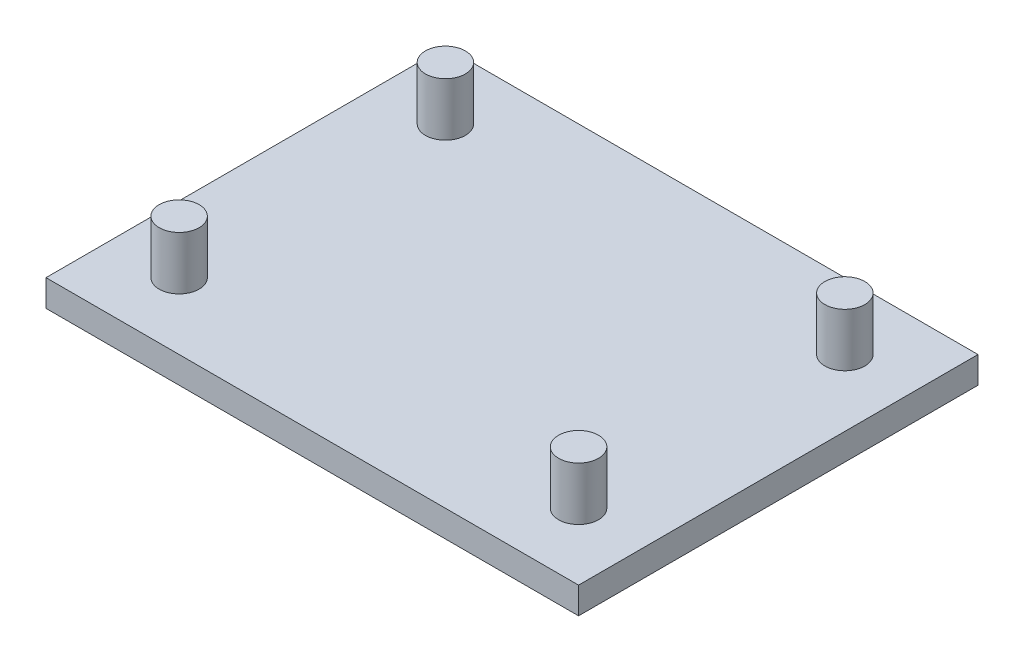
ISO-10303-21;
HEADER;
FILE_DESCRIPTION(('STEP AP214'),'2;1');
FILE_NAME('part.step','',(''),(''),'','','');
FILE_SCHEMA(('AUTOMOTIVE_DESIGN { 1 0 10303 214 1 1 1 1 }'));
ENDSEC;
DATA;
#1=APPLICATION_CONTEXT('core data for automotive mechanical design processes');
#2=APPLICATION_PROTOCOL_DEFINITION('international standard','automotive_design',2000,#1);
#3=PRODUCT_CONTEXT('',#1,'mechanical');
#4=PRODUCT('Part','Part','',(#3));
#5=PRODUCT_RELATED_PRODUCT_CATEGORY('part','',(#4));
#6=PRODUCT_DEFINITION_FORMATION('','',#4);
#7=PRODUCT_DEFINITION_CONTEXT('part definition',#1,'design');
#8=PRODUCT_DEFINITION('design','',#6,#7);
#9=PRODUCT_DEFINITION_SHAPE('','',#8);
#10=(LENGTH_UNIT() NAMED_UNIT(*) SI_UNIT(.MILLI.,.METRE.));
#11=(NAMED_UNIT(*) PLANE_ANGLE_UNIT() SI_UNIT($,.RADIAN.));
#12=(NAMED_UNIT(*) SI_UNIT($,.STERADIAN.) SOLID_ANGLE_UNIT());
#13=UNCERTAINTY_MEASURE_WITH_UNIT(LENGTH_MEASURE(1.E-05),#10,'distance_accuracy_value','');
#14=(GEOMETRIC_REPRESENTATION_CONTEXT(3) GLOBAL_UNCERTAINTY_ASSIGNED_CONTEXT((#13)) GLOBAL_UNIT_ASSIGNED_CONTEXT((#10,
#11,#12)) REPRESENTATION_CONTEXT('',''));
#15=CARTESIAN_POINT('',(0.,0.,0.));
#16=DIRECTION('',(0.,0.,1.));
#17=DIRECTION('',(1.,0.,0.));
#18=AXIS2_PLACEMENT_3D('',#15,#16,#17);
#19=CARTESIAN_POINT('',(100.,10.,75.));
#20=DIRECTION('',(-1.,0.,0.));
#21=DIRECTION('',(0.,0.,1.));
#22=AXIS2_PLACEMENT_3D('',#19,#20,#21);
#23=PLANE('',#22);
#24=DIRECTION('',(0.,0.,-1.));
#25=VECTOR('',#24,1.);
#26=CARTESIAN_POINT('',(100.,0.,75.));
#27=LINE('',#26,#25);
#28=CARTESIAN_POINT('',(100.,0.,75.));
#29=VERTEX_POINT('',#28);
#30=CARTESIAN_POINT('',(100.,0.,-75.));
#31=VERTEX_POINT('',#30);
#32=EDGE_CURVE('E100',#29,#31,#27,.T.);
#33=ORIENTED_EDGE('',*,*,#32,.T.);
#34=DIRECTION('',(0.,-1.,0.));
#35=VECTOR('',#34,1.);
#36=CARTESIAN_POINT('',(100.,10.,-75.));
#37=LINE('',#36,#35);
#38=CARTESIAN_POINT('',(100.,10.,-75.));
#39=VERTEX_POINT('',#38);
#40=EDGE_CURVE('E91',#39,#31,#37,.T.);
#41=ORIENTED_EDGE('',*,*,#40,.F.);
#42=DIRECTION('',(0.,0.,-1.));
#43=VECTOR('',#42,1.);
#44=CARTESIAN_POINT('',(100.,10.,75.));
#45=LINE('',#44,#43);
#46=CARTESIAN_POINT('',(100.,10.,75.));
#47=VERTEX_POINT('',#46);
#48=EDGE_CURVE('E85',#47,#39,#45,.T.);
#49=ORIENTED_EDGE('',*,*,#48,.F.);
#50=DIRECTION('',(0.,-1.,0.));
#51=VECTOR('',#50,1.);
#52=CARTESIAN_POINT('',(100.,10.,75.));
#53=LINE('',#52,#51);
#54=EDGE_CURVE('E96',#47,#29,#53,.T.);
#55=ORIENTED_EDGE('',*,*,#54,.T.);
#56=EDGE_LOOP('',(#33,#41,#49,#55));
#57=FACE_BOUND('',#56,.T.);
#58=ADVANCED_FACE('F33',(#57),#23,.F.);
#59=CARTESIAN_POINT('',(-100.,10.,-75.));
#60=DIRECTION('',(0.,0.,1.));
#61=DIRECTION('',(1.,0.,0.));
#62=AXIS2_PLACEMENT_3D('',#59,#60,#61);
#63=PLANE('',#62);
#64=DIRECTION('',(-1.,0.,0.));
#65=VECTOR('',#64,1.);
#66=CARTESIAN_POINT('',(-100.,0.,-75.));
#67=LINE('',#66,#65);
#68=CARTESIAN_POINT('',(-100.,0.,-75.));
#69=VERTEX_POINT('',#68);
#70=EDGE_CURVE('E90',#31,#69,#67,.T.);
#71=ORIENTED_EDGE('',*,*,#70,.T.);
#72=DIRECTION('',(0.,-1.,0.));
#73=VECTOR('',#72,1.);
#74=CARTESIAN_POINT('',(-100.,10.,-75.));
#75=LINE('',#74,#73);
#76=CARTESIAN_POINT('',(-100.,10.,-75.));
#77=VERTEX_POINT('',#76);
#78=EDGE_CURVE('E88',#77,#69,#75,.T.);
#79=ORIENTED_EDGE('',*,*,#78,.F.);
#80=DIRECTION('',(-1.,0.,0.));
#81=VECTOR('',#80,1.);
#82=CARTESIAN_POINT('',(-100.,10.,-75.));
#83=LINE('',#82,#81);
#84=EDGE_CURVE('E80',#39,#77,#83,.T.);
#85=ORIENTED_EDGE('',*,*,#84,.F.);
#86=ORIENTED_EDGE('',*,*,#40,.T.);
#87=EDGE_LOOP('',(#71,#79,#85,#86));
#88=FACE_BOUND('',#87,.T.);
#89=ADVANCED_FACE('F89',(#88),#63,.F.);
#90=CARTESIAN_POINT('',(-100.,10.,75.));
#91=DIRECTION('',(1.,0.,0.));
#92=DIRECTION('',(0.,0.,-1.));
#93=AXIS2_PLACEMENT_3D('',#90,#91,#92);
#94=PLANE('',#93);
#95=DIRECTION('',(0.,0.,1.));
#96=VECTOR('',#95,1.);
#97=CARTESIAN_POINT('',(-100.,0.,75.));
#98=LINE('',#97,#96);
#99=CARTESIAN_POINT('',(-100.,0.,75.));
#100=VERTEX_POINT('',#99);
#101=EDGE_CURVE('E66',#69,#100,#98,.T.);
#102=ORIENTED_EDGE('',*,*,#101,.T.);
#103=DIRECTION('',(0.,-1.,0.));
#104=VECTOR('',#103,1.);
#105=CARTESIAN_POINT('',(-100.,10.,75.));
#106=LINE('',#105,#104);
#107=CARTESIAN_POINT('',(-100.,10.,75.));
#108=VERTEX_POINT('',#107);
#109=EDGE_CURVE('E92',#108,#100,#106,.T.);
#110=ORIENTED_EDGE('',*,*,#109,.F.);
#111=DIRECTION('',(0.,0.,1.));
#112=VECTOR('',#111,1.);
#113=CARTESIAN_POINT('',(-100.,10.,75.));
#114=LINE('',#113,#112);
#115=EDGE_CURVE('E83',#77,#108,#114,.T.);
#116=ORIENTED_EDGE('',*,*,#115,.F.);
#117=ORIENTED_EDGE('',*,*,#78,.T.);
#118=EDGE_LOOP('',(#102,#110,#116,#117));
#119=FACE_BOUND('',#118,.T.);
#120=ADVANCED_FACE('F94',(#119),#94,.F.);
#121=CARTESIAN_POINT('',(-100.,10.,75.));
#122=DIRECTION('',(0.,0.,-1.));
#123=DIRECTION('',(-1.,0.,0.));
#124=AXIS2_PLACEMENT_3D('',#121,#122,#123);
#125=PLANE('',#124);
#126=DIRECTION('',(1.,0.,0.));
#127=VECTOR('',#126,1.);
#128=CARTESIAN_POINT('',(-100.,0.,75.));
#129=LINE('',#128,#127);
#130=EDGE_CURVE('E72',#100,#29,#129,.T.);
#131=ORIENTED_EDGE('',*,*,#130,.T.);
#132=ORIENTED_EDGE('',*,*,#54,.F.);
#133=DIRECTION('',(1.,0.,0.));
#134=VECTOR('',#133,1.);
#135=CARTESIAN_POINT('',(-100.,10.,75.));
#136=LINE('',#135,#134);
#137=EDGE_CURVE('E49',#108,#47,#136,.T.);
#138=ORIENTED_EDGE('',*,*,#137,.F.);
#139=ORIENTED_EDGE('',*,*,#109,.T.);
#140=EDGE_LOOP('',(#131,#132,#138,#139));
#141=FACE_BOUND('',#140,.T.);
#142=ADVANCED_FACE('F123',(#141),#125,.F.);
#143=CARTESIAN_POINT('',(0.,10.,0.));
#144=DIRECTION('',(0.,-1.,0.));
#145=DIRECTION('',(0.,0.,-1.));
#146=AXIS2_PLACEMENT_3D('',#143,#144,#145);
#147=PLANE('',#146);
#148=CARTESIAN_POINT('',(-75.,10.,-50.));
#149=DIRECTION('',(0.,-1.,0.));
#150=DIRECTION('',(0.,0.,-1.));
#151=AXIS2_PLACEMENT_3D('',#148,#149,#150);
#152=CIRCLE('',#151,7.50000000000001);
#153=CARTESIAN_POINT('',(-75.,10.,-57.5));
#154=VERTEX_POINT('',#153);
#155=EDGE_CURVE('E11',#154,#154,#152,.F.);
#156=ORIENTED_EDGE('',*,*,#155,.F.);
#157=EDGE_LOOP('',(#156));
#158=FACE_BOUND('',#157,.T.);
#159=CARTESIAN_POINT('',(-75.,10.,50.));
#160=DIRECTION('',(0.,-1.,0.));
#161=DIRECTION('',(0.,0.,-1.));
#162=AXIS2_PLACEMENT_3D('',#159,#160,#161);
#163=CIRCLE('',#162,7.50000000000001);
#164=CARTESIAN_POINT('',(-75.,10.,42.5));
#165=VERTEX_POINT('',#164);
#166=EDGE_CURVE('E41',#165,#165,#163,.F.);
#167=ORIENTED_EDGE('',*,*,#166,.F.);
#168=EDGE_LOOP('',(#167));
#169=FACE_BOUND('',#168,.T.);
#170=CARTESIAN_POINT('',(75.,10.,50.));
#171=DIRECTION('',(0.,-1.,0.));
#172=DIRECTION('',(0.,0.,-1.));
#173=AXIS2_PLACEMENT_3D('',#170,#171,#172);
#174=CIRCLE('',#173,7.50000000000001);
#175=CARTESIAN_POINT('',(75.,10.,42.5));
#176=VERTEX_POINT('',#175);
#177=EDGE_CURVE('E113',#176,#176,#174,.F.);
#178=ORIENTED_EDGE('',*,*,#177,.F.);
#179=EDGE_LOOP('',(#178));
#180=FACE_BOUND('',#179,.T.);
#181=CARTESIAN_POINT('',(75.,10.,-50.));
#182=DIRECTION('',(0.,-1.,0.));
#183=DIRECTION('',(0.,0.,-1.));
#184=AXIS2_PLACEMENT_3D('',#181,#182,#183);
#185=CIRCLE('',#184,7.50000000000001);
#186=CARTESIAN_POINT('',(75.,10.,-57.5));
#187=VERTEX_POINT('',#186);
#188=EDGE_CURVE('E110',#187,#187,#185,.F.);
#189=ORIENTED_EDGE('',*,*,#188,.F.);
#190=EDGE_LOOP('',(#189));
#191=FACE_BOUND('',#190,.T.);
#192=ORIENTED_EDGE('',*,*,#48,.T.);
#193=ORIENTED_EDGE('',*,*,#84,.T.);
#194=ORIENTED_EDGE('',*,*,#115,.T.);
#195=ORIENTED_EDGE('',*,*,#137,.T.);
#196=EDGE_LOOP('',(#192,#193,#194,#195));
#197=FACE_BOUND('',#196,.T.);
#198=ADVANCED_FACE('F81',(#158,#169,#180,#191,#197),#147,.F.);
#199=CARTESIAN_POINT('',(0.,0.,0.));
#200=DIRECTION('',(0.,-1.,0.));
#201=DIRECTION('',(0.,0.,-1.));
#202=AXIS2_PLACEMENT_3D('',#199,#200,#201);
#203=PLANE('',#202);
#204=ORIENTED_EDGE('',*,*,#32,.F.);
#205=ORIENTED_EDGE('',*,*,#130,.F.);
#206=ORIENTED_EDGE('',*,*,#101,.F.);
#207=ORIENTED_EDGE('',*,*,#70,.F.);
#208=EDGE_LOOP('',(#204,#205,#206,#207));
#209=FACE_BOUND('',#208,.T.);
#210=ADVANCED_FACE('F122',(#209),#203,.T.);
#211=CARTESIAN_POINT('',(75.,30.,-50.));
#212=DIRECTION('',(0.,-1.,0.));
#213=DIRECTION('',(0.,0.,-1.));
#214=AXIS2_PLACEMENT_3D('',#211,#212,#213);
#215=CYLINDRICAL_SURFACE('',#214,7.50000000000001);
#216=CARTESIAN_POINT('',(75.,30.,-50.));
#217=DIRECTION('',(0.,1.,0.));
#218=DIRECTION('',(0.,0.,1.));
#219=AXIS2_PLACEMENT_3D('',#216,#217,#218);
#220=CIRCLE('',#219,7.50000000000001);
#221=CARTESIAN_POINT('',(75.,30.,-42.5));
#222=VERTEX_POINT('',#221);
#223=EDGE_CURVE('E103',#222,#222,#220,.T.);
#224=ORIENTED_EDGE('',*,*,#223,.F.);
#225=EDGE_LOOP('',(#224));
#226=FACE_BOUND('',#225,.T.);
#227=ORIENTED_EDGE('',*,*,#188,.T.);
#228=EDGE_LOOP('',(#227));
#229=FACE_BOUND('',#228,.T.);
#230=ADVANCED_FACE('F130',(#226,#229),#215,.T.);
#231=CARTESIAN_POINT('',(75.,30.,-50.));
#232=DIRECTION('',(0.,1.,0.));
#233=DIRECTION('',(0.,0.,1.));
#234=AXIS2_PLACEMENT_3D('',#231,#232,#233);
#235=PLANE('',#234);
#236=ORIENTED_EDGE('',*,*,#223,.T.);
#237=EDGE_LOOP('',(#236));
#238=FACE_BOUND('',#237,.T.);
#239=ADVANCED_FACE('F132',(#238),#235,.T.);
#240=CARTESIAN_POINT('',(75.,30.,50.));
#241=DIRECTION('',(0.,-1.,0.));
#242=DIRECTION('',(0.,0.,-1.));
#243=AXIS2_PLACEMENT_3D('',#240,#241,#242);
#244=CYLINDRICAL_SURFACE('',#243,7.50000000000001);
#245=CARTESIAN_POINT('',(75.,30.,50.));
#246=DIRECTION('',(0.,1.,0.));
#247=DIRECTION('',(0.,0.,1.));
#248=AXIS2_PLACEMENT_3D('',#245,#246,#247);
#249=CIRCLE('',#248,7.50000000000001);
#250=CARTESIAN_POINT('',(75.,30.,57.5));
#251=VERTEX_POINT('',#250);
#252=EDGE_CURVE('E261',#251,#251,#249,.T.);
#253=ORIENTED_EDGE('',*,*,#252,.F.);
#254=EDGE_LOOP('',(#253));
#255=FACE_BOUND('',#254,.T.);
#256=ORIENTED_EDGE('',*,*,#177,.T.);
#257=EDGE_LOOP('',(#256));
#258=FACE_BOUND('',#257,.T.);
#259=ADVANCED_FACE('F139',(#255,#258),#244,.T.);
#260=CARTESIAN_POINT('',(75.,30.,50.));
#261=DIRECTION('',(0.,1.,0.));
#262=DIRECTION('',(0.,0.,1.));
#263=AXIS2_PLACEMENT_3D('',#260,#261,#262);
#264=PLANE('',#263);
#265=ORIENTED_EDGE('',*,*,#252,.T.);
#266=EDGE_LOOP('',(#265));
#267=FACE_BOUND('',#266,.T.);
#268=ADVANCED_FACE('F202',(#267),#264,.T.);
#269=CARTESIAN_POINT('',(-75.,30.,50.));
#270=DIRECTION('',(0.,-1.,0.));
#271=DIRECTION('',(0.,0.,-1.));
#272=AXIS2_PLACEMENT_3D('',#269,#270,#271);
#273=CYLINDRICAL_SURFACE('',#272,7.50000000000001);
#274=CARTESIAN_POINT('',(-75.,30.,50.));
#275=DIRECTION('',(0.,1.,0.));
#276=DIRECTION('',(0.,0.,1.));
#277=AXIS2_PLACEMENT_3D('',#274,#275,#276);
#278=CIRCLE('',#277,7.50000000000001);
#279=CARTESIAN_POINT('',(-75.,30.,57.5));
#280=VERTEX_POINT('',#279);
#281=EDGE_CURVE('E258',#280,#280,#278,.T.);
#282=ORIENTED_EDGE('',*,*,#281,.F.);
#283=EDGE_LOOP('',(#282));
#284=FACE_BOUND('',#283,.T.);
#285=ORIENTED_EDGE('',*,*,#166,.T.);
#286=EDGE_LOOP('',(#285));
#287=FACE_BOUND('',#286,.T.);
#288=ADVANCED_FACE('F118',(#284,#287),#273,.T.);
#289=CARTESIAN_POINT('',(-75.,30.,50.));
#290=DIRECTION('',(0.,1.,0.));
#291=DIRECTION('',(0.,0.,1.));
#292=AXIS2_PLACEMENT_3D('',#289,#290,#291);
#293=PLANE('',#292);
#294=ORIENTED_EDGE('',*,*,#281,.T.);
#295=EDGE_LOOP('',(#294));
#296=FACE_BOUND('',#295,.T.);
#297=ADVANCED_FACE('F219',(#296),#293,.T.);
#298=CARTESIAN_POINT('',(-75.,30.,-50.));
#299=DIRECTION('',(0.,-1.,0.));
#300=DIRECTION('',(0.,0.,-1.));
#301=AXIS2_PLACEMENT_3D('',#298,#299,#300);
#302=CYLINDRICAL_SURFACE('',#301,7.50000000000001);
#303=CARTESIAN_POINT('',(-75.,30.,-50.));
#304=DIRECTION('',(0.,1.,0.));
#305=DIRECTION('',(0.,0.,1.));
#306=AXIS2_PLACEMENT_3D('',#303,#304,#305);
#307=CIRCLE('',#306,7.50000000000001);
#308=CARTESIAN_POINT('',(-75.,30.,-42.5));
#309=VERTEX_POINT('',#308);
#310=EDGE_CURVE('E257',#309,#309,#307,.T.);
#311=ORIENTED_EDGE('',*,*,#310,.F.);
#312=EDGE_LOOP('',(#311));
#313=FACE_BOUND('',#312,.T.);
#314=ORIENTED_EDGE('',*,*,#155,.T.);
#315=EDGE_LOOP('',(#314));
#316=FACE_BOUND('',#315,.T.);
#317=ADVANCED_FACE('F228',(#313,#316),#302,.T.);
#318=CARTESIAN_POINT('',(-75.,30.,-50.));
#319=DIRECTION('',(0.,1.,0.));
#320=DIRECTION('',(0.,0.,1.));
#321=AXIS2_PLACEMENT_3D('',#318,#319,#320);
#322=PLANE('',#321);
#323=ORIENTED_EDGE('',*,*,#310,.T.);
#324=EDGE_LOOP('',(#323));
#325=FACE_BOUND('',#324,.T.);
#326=ADVANCED_FACE('F237',(#325),#322,.T.);
#327=CLOSED_SHELL('',(#58,#89,#120,#142,#198,#210,#230,#239,#259,#268,#288,#297,#317,#326));
#328=MANIFOLD_SOLID_BREP('B2',#327);
#329=ADVANCED_BREP_SHAPE_REPRESENTATION('',(#18,#328),#14);
#330=SHAPE_DEFINITION_REPRESENTATION(#9,#329);
ENDSEC;
END-ISO-10303-21;
